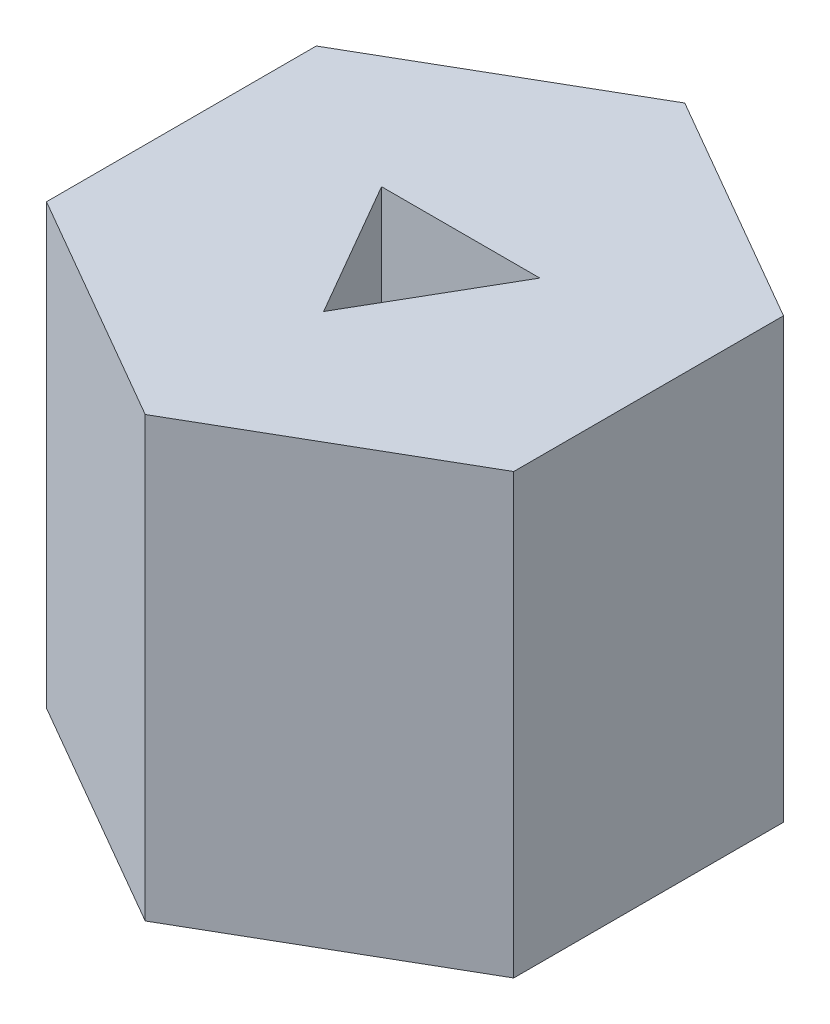
ISO-10303-21;
HEADER;
FILE_DESCRIPTION(('STEP AP214'),'2;1');
FILE_NAME('part.step','',(''),(''),'','','');
FILE_SCHEMA(('AUTOMOTIVE_DESIGN { 1 0 10303 214 1 1 1 1 }'));
ENDSEC;
DATA;
#1=APPLICATION_CONTEXT('core data for automotive mechanical design processes');
#2=APPLICATION_PROTOCOL_DEFINITION('international standard','automotive_design',2000,#1);
#3=PRODUCT_CONTEXT('',#1,'mechanical');
#4=PRODUCT('Part','Part','',(#3));
#5=PRODUCT_RELATED_PRODUCT_CATEGORY('part','',(#4));
#6=PRODUCT_DEFINITION_FORMATION('','',#4);
#7=PRODUCT_DEFINITION_CONTEXT('part definition',#1,'design');
#8=PRODUCT_DEFINITION('design','',#6,#7);
#9=PRODUCT_DEFINITION_SHAPE('','',#8);
#10=(LENGTH_UNIT() NAMED_UNIT(*) SI_UNIT(.MILLI.,.METRE.));
#11=(NAMED_UNIT(*) PLANE_ANGLE_UNIT() SI_UNIT($,.RADIAN.));
#12=(NAMED_UNIT(*) SI_UNIT($,.STERADIAN.) SOLID_ANGLE_UNIT());
#13=UNCERTAINTY_MEASURE_WITH_UNIT(LENGTH_MEASURE(1.E-05),#10,'distance_accuracy_value','');
#14=(GEOMETRIC_REPRESENTATION_CONTEXT(3) GLOBAL_UNCERTAINTY_ASSIGNED_CONTEXT((#13)) GLOBAL_UNIT_ASSIGNED_CONTEXT((#10,
#11,#12)) REPRESENTATION_CONTEXT('',''));
#15=CARTESIAN_POINT('',(0.,0.,0.));
#16=DIRECTION('',(0.,0.,1.));
#17=DIRECTION('',(1.,0.,0.));
#18=AXIS2_PLACEMENT_3D('',#15,#16,#17);
#19=CARTESIAN_POINT('',(6.39126747992918,12.,-3.69000000000011));
#20=DIRECTION('',(-0.499999999999995,0.,0.866025403784441));
#21=DIRECTION('',(0.866025403784442,0.,0.499999999999995));
#22=AXIS2_PLACEMENT_3D('',#19,#20,#21);
#23=PLANE('',#22);
#24=DIRECTION('',(-0.866025403784441,0.,-0.499999999999995));
#25=VECTOR('',#24,1.);
#26=CARTESIAN_POINT('',(6.39126747992918,0.,-3.69000000000011));
#27=LINE('',#26,#25);
#28=CARTESIAN_POINT('',(6.39126747992918,0.,-3.69000000000011));
#29=VERTEX_POINT('',#28);
#30=CARTESIAN_POINT('',(0.,0.,-7.38000000000007));
#31=VERTEX_POINT('',#30);
#32=EDGE_CURVE('E130',#29,#31,#27,.T.);
#33=ORIENTED_EDGE('',*,*,#32,.T.);
#34=DIRECTION('',(0.,-1.,0.));
#35=VECTOR('',#34,1.);
#36=CARTESIAN_POINT('',(0.,12.,-7.38000000000007));
#37=LINE('',#36,#35);
#38=CARTESIAN_POINT('',(0.,12.,-7.38000000000007));
#39=VERTEX_POINT('',#38);
#40=EDGE_CURVE('E11',#39,#31,#37,.T.);
#41=ORIENTED_EDGE('',*,*,#40,.F.);
#42=DIRECTION('',(-0.866025403784441,0.,-0.499999999999995));
#43=VECTOR('',#42,1.);
#44=CARTESIAN_POINT('',(6.39126747992918,12.,-3.69000000000011));
#45=LINE('',#44,#43);
#46=CARTESIAN_POINT('',(6.39126747992918,12.,-3.69000000000011));
#47=VERTEX_POINT('',#46);
#48=EDGE_CURVE('E131',#47,#39,#45,.T.);
#49=ORIENTED_EDGE('',*,*,#48,.F.);
#50=DIRECTION('',(0.,-1.,0.));
#51=VECTOR('',#50,1.);
#52=CARTESIAN_POINT('',(6.39126747992918,12.,-3.69000000000011));
#53=LINE('',#52,#51);
#54=EDGE_CURVE('E145',#47,#29,#53,.T.);
#55=ORIENTED_EDGE('',*,*,#54,.T.);
#56=EDGE_LOOP('',(#33,#41,#49,#55));
#57=FACE_BOUND('',#56,.T.);
#58=ADVANCED_FACE('F33',(#57),#23,.F.);
#59=CARTESIAN_POINT('',(0.,12.,-7.38000000000007));
#60=DIRECTION('',(0.500000000000001,0.,0.866025403784438));
#61=DIRECTION('',(0.866025403784438,0.,-0.500000000000001));
#62=AXIS2_PLACEMENT_3D('',#59,#60,#61);
#63=PLANE('',#62);
#64=DIRECTION('',(-0.866025403784438,0.,0.500000000000001));
#65=VECTOR('',#64,1.);
#66=CARTESIAN_POINT('',(0.,0.,-7.38000000000007));
#67=LINE('',#66,#65);
#68=CARTESIAN_POINT('',(-6.39126747992923,0.,-3.69000000000002));
#69=VERTEX_POINT('',#68);
#70=EDGE_CURVE('E148',#31,#69,#67,.T.);
#71=ORIENTED_EDGE('',*,*,#70,.T.);
#72=DIRECTION('',(0.,-1.,0.));
#73=VECTOR('',#72,1.);
#74=CARTESIAN_POINT('',(-6.39126747992923,12.,-3.69000000000002));
#75=LINE('',#74,#73);
#76=CARTESIAN_POINT('',(-6.39126747992923,12.,-3.69000000000002));
#77=VERTEX_POINT('',#76);
#78=EDGE_CURVE('E40',#77,#69,#75,.T.);
#79=ORIENTED_EDGE('',*,*,#78,.F.);
#80=DIRECTION('',(-0.866025403784438,0.,0.500000000000001));
#81=VECTOR('',#80,1.);
#82=CARTESIAN_POINT('',(0.,12.,-7.38000000000007));
#83=LINE('',#82,#81);
#84=EDGE_CURVE('E134',#39,#77,#83,.T.);
#85=ORIENTED_EDGE('',*,*,#84,.F.);
#86=ORIENTED_EDGE('',*,*,#40,.T.);
#87=EDGE_LOOP('',(#71,#79,#85,#86));
#88=FACE_BOUND('',#87,.T.);
#89=ADVANCED_FACE('F193',(#88),#63,.F.);
#90=CARTESIAN_POINT('',(-6.39126747992923,12.,-3.69000000000002));
#91=DIRECTION('',(1.,0.,0.));
#92=DIRECTION('',(0.,0.,-1.));
#93=AXIS2_PLACEMENT_3D('',#90,#91,#92);
#94=PLANE('',#93);
#95=DIRECTION('',(0.,0.,1.));
#96=VECTOR('',#95,1.);
#97=CARTESIAN_POINT('',(-6.39126747992923,0.,-3.69000000000002));
#98=LINE('',#97,#96);
#99=CARTESIAN_POINT('',(-6.3912674799292,0.,3.69000000000007));
#100=VERTEX_POINT('',#99);
#101=EDGE_CURVE('E150',#69,#100,#98,.T.);
#102=ORIENTED_EDGE('',*,*,#101,.T.);
#103=DIRECTION('',(0.,-1.,0.));
#104=VECTOR('',#103,1.);
#105=CARTESIAN_POINT('',(-6.3912674799292,12.,3.69000000000007));
#106=LINE('',#105,#104);
#107=CARTESIAN_POINT('',(-6.3912674799292,12.,3.69000000000007));
#108=VERTEX_POINT('',#107);
#109=EDGE_CURVE('E165',#108,#100,#106,.T.);
#110=ORIENTED_EDGE('',*,*,#109,.F.);
#111=DIRECTION('',(0.,0.,1.));
#112=VECTOR('',#111,1.);
#113=CARTESIAN_POINT('',(-6.39126747992923,12.,-3.69000000000002));
#114=LINE('',#113,#112);
#115=EDGE_CURVE('E137',#77,#108,#114,.T.);
#116=ORIENTED_EDGE('',*,*,#115,.F.);
#117=ORIENTED_EDGE('',*,*,#78,.T.);
#118=EDGE_LOOP('',(#102,#110,#116,#117));
#119=FACE_BOUND('',#118,.T.);
#120=ADVANCED_FACE('F172',(#119),#94,.F.);
#121=CARTESIAN_POINT('',(-6.3912674799292,12.,3.69000000000007));
#122=DIRECTION('',(0.499999999999995,0.,-0.866025403784441));
#123=DIRECTION('',(-0.866025403784442,0.,-0.499999999999995));
#124=AXIS2_PLACEMENT_3D('',#121,#122,#123);
#125=PLANE('',#124);
#126=DIRECTION('',(0.866025403784442,0.,0.499999999999995));
#127=VECTOR('',#126,1.);
#128=CARTESIAN_POINT('',(-6.3912674799292,0.,3.69000000000007));
#129=LINE('',#128,#127);
#130=CARTESIAN_POINT('',(0.,0.,7.38000000000007));
#131=VERTEX_POINT('',#130);
#132=EDGE_CURVE('E152',#100,#131,#129,.T.);
#133=ORIENTED_EDGE('',*,*,#132,.T.);
#134=DIRECTION('',(0.,-1.,0.));
#135=VECTOR('',#134,1.);
#136=CARTESIAN_POINT('',(0.,12.,7.38000000000007));
#137=LINE('',#136,#135);
#138=CARTESIAN_POINT('',(0.,12.,7.38000000000007));
#139=VERTEX_POINT('',#138);
#140=EDGE_CURVE('E162',#139,#131,#137,.T.);
#141=ORIENTED_EDGE('',*,*,#140,.F.);
#142=DIRECTION('',(0.866025403784442,0.,0.499999999999995));
#143=VECTOR('',#142,1.);
#144=CARTESIAN_POINT('',(-6.3912674799292,12.,3.69000000000007));
#145=LINE('',#144,#143);
#146=EDGE_CURVE('E139',#108,#139,#145,.T.);
#147=ORIENTED_EDGE('',*,*,#146,.F.);
#148=ORIENTED_EDGE('',*,*,#109,.T.);
#149=EDGE_LOOP('',(#133,#141,#147,#148));
#150=FACE_BOUND('',#149,.T.);
#151=ADVANCED_FACE('F181',(#150),#125,.F.);
#152=CARTESIAN_POINT('',(0.,12.,7.38000000000007));
#153=DIRECTION('',(-0.500000000000007,0.,-0.866025403784434));
#154=DIRECTION('',(-0.866025403784435,0.,0.500000000000007));
#155=AXIS2_PLACEMENT_3D('',#152,#153,#154);
#156=PLANE('',#155);
#157=DIRECTION('',(0.866025403784435,0.,-0.500000000000007));
#158=VECTOR('',#157,1.);
#159=CARTESIAN_POINT('',(0.,0.,7.38000000000007));
#160=LINE('',#159,#158);
#161=CARTESIAN_POINT('',(6.39126747992926,0.,3.68999999999998));
#162=VERTEX_POINT('',#161);
#163=EDGE_CURVE('E154',#131,#162,#160,.T.);
#164=ORIENTED_EDGE('',*,*,#163,.T.);
#165=DIRECTION('',(0.,-1.,0.));
#166=VECTOR('',#165,1.);
#167=CARTESIAN_POINT('',(6.39126747992926,12.,3.68999999999998));
#168=LINE('',#167,#166);
#169=CARTESIAN_POINT('',(6.39126747992926,12.,3.68999999999998));
#170=VERTEX_POINT('',#169);
#171=EDGE_CURVE('E159',#170,#162,#168,.T.);
#172=ORIENTED_EDGE('',*,*,#171,.F.);
#173=DIRECTION('',(0.866025403784435,0.,-0.500000000000007));
#174=VECTOR('',#173,1.);
#175=CARTESIAN_POINT('',(0.,12.,7.38000000000007));
#176=LINE('',#175,#174);
#177=EDGE_CURVE('E141',#139,#170,#176,.T.);
#178=ORIENTED_EDGE('',*,*,#177,.F.);
#179=ORIENTED_EDGE('',*,*,#140,.T.);
#180=EDGE_LOOP('',(#164,#172,#178,#179));
#181=FACE_BOUND('',#180,.T.);
#182=ADVANCED_FACE('F185',(#181),#156,.F.);
#183=CARTESIAN_POINT('',(6.39126747992926,12.,3.68999999999998));
#184=DIRECTION('',(-1.,0.,0.));
#185=DIRECTION('',(0.,0.,1.));
#186=AXIS2_PLACEMENT_3D('',#183,#184,#185);
#187=PLANE('',#186);
#188=DIRECTION('',(0.,0.,-1.));
#189=VECTOR('',#188,1.);
#190=CARTESIAN_POINT('',(6.39126747992926,0.,3.68999999999998));
#191=LINE('',#190,#189);
#192=EDGE_CURVE('E135',#162,#29,#191,.T.);
#193=ORIENTED_EDGE('',*,*,#192,.T.);
#194=ORIENTED_EDGE('',*,*,#54,.F.);
#195=DIRECTION('',(0.,0.,-1.));
#196=VECTOR('',#195,1.);
#197=CARTESIAN_POINT('',(6.39126747992926,12.,3.68999999999998));
#198=LINE('',#197,#196);
#199=EDGE_CURVE('E143',#170,#47,#198,.T.);
#200=ORIENTED_EDGE('',*,*,#199,.F.);
#201=ORIENTED_EDGE('',*,*,#171,.T.);
#202=EDGE_LOOP('',(#193,#194,#200,#201));
#203=FACE_BOUND('',#202,.T.);
#204=ADVANCED_FACE('F196',(#203),#187,.F.);
#205=CARTESIAN_POINT('',(0.,12.,0.));
#206=DIRECTION('',(0.,1.,0.));
#207=DIRECTION('',(0.,0.,1.));
#208=AXIS2_PLACEMENT_3D('',#205,#206,#207);
#209=PLANE('',#208);
#210=DIRECTION('',(-1.,0.,0.));
#211=VECTOR('',#210,1.);
#212=CARTESIAN_POINT('',(0.,12.,-1.24999999999998));
#213=LINE('',#212,#211);
#214=CARTESIAN_POINT('',(2.16506350946111,12.,-1.24999999999998));
#215=VERTEX_POINT('',#214);
#216=CARTESIAN_POINT('',(-2.16506350946111,12.,-1.24999999999998));
#217=VERTEX_POINT('',#216);
#218=EDGE_CURVE('E128',#215,#217,#213,.T.);
#219=ORIENTED_EDGE('',*,*,#218,.F.);
#220=DIRECTION('',(0.500000000000004,0.,-0.866025403784436));
#221=VECTOR('',#220,1.);
#222=CARTESIAN_POINT('',(1.08253175473055,12.,0.62500000000001));
#223=LINE('',#222,#221);
#224=CARTESIAN_POINT('',(0.,12.,2.5));
#225=VERTEX_POINT('',#224);
#226=EDGE_CURVE('E124',#225,#215,#223,.T.);
#227=ORIENTED_EDGE('',*,*,#226,.F.);
#228=DIRECTION('',(0.500000000000004,0.,0.866025403784436));
#229=VECTOR('',#228,1.);
#230=CARTESIAN_POINT('',(-1.08253175473055,12.,0.62500000000001));
#231=LINE('',#230,#229);
#232=EDGE_CURVE('E108',#217,#225,#231,.T.);
#233=ORIENTED_EDGE('',*,*,#232,.F.);
#234=EDGE_LOOP('',(#219,#227,#233));
#235=FACE_BOUND('',#234,.T.);
#236=ORIENTED_EDGE('',*,*,#48,.T.);
#237=ORIENTED_EDGE('',*,*,#84,.T.);
#238=ORIENTED_EDGE('',*,*,#115,.T.);
#239=ORIENTED_EDGE('',*,*,#146,.T.);
#240=ORIENTED_EDGE('',*,*,#177,.T.);
#241=ORIENTED_EDGE('',*,*,#199,.T.);
#242=EDGE_LOOP('',(#236,#237,#238,#239,#240,#241));
#243=FACE_BOUND('',#242,.T.);
#244=ADVANCED_FACE('F189',(#235,#243),#209,.T.);
#245=CARTESIAN_POINT('',(0.,0.,0.));
#246=DIRECTION('',(0.,1.,0.));
#247=DIRECTION('',(0.,0.,1.));
#248=AXIS2_PLACEMENT_3D('',#245,#246,#247);
#249=PLANE('',#248);
#250=DIRECTION('',(-0.500000000000004,0.,0.866025403784436));
#251=VECTOR('',#250,1.);
#252=CARTESIAN_POINT('',(1.08253175473055,0.,0.62500000000001));
#253=LINE('',#252,#251);
#254=CARTESIAN_POINT('',(2.16506350946111,0.,-1.24999999999998));
#255=VERTEX_POINT('',#254);
#256=CARTESIAN_POINT('',(0.,0.,2.5));
#257=VERTEX_POINT('',#256);
#258=EDGE_CURVE('E114',#255,#257,#253,.T.);
#259=ORIENTED_EDGE('',*,*,#258,.F.);
#260=DIRECTION('',(1.,0.,0.));
#261=VECTOR('',#260,1.);
#262=CARTESIAN_POINT('',(0.,0.,-1.24999999999998));
#263=LINE('',#262,#261);
#264=CARTESIAN_POINT('',(-2.16506350946111,0.,-1.24999999999998));
#265=VERTEX_POINT('',#264);
#266=EDGE_CURVE('E55',#265,#255,#263,.T.);
#267=ORIENTED_EDGE('',*,*,#266,.F.);
#268=DIRECTION('',(-0.500000000000004,0.,-0.866025403784436));
#269=VECTOR('',#268,1.);
#270=CARTESIAN_POINT('',(-1.08253175473055,0.,0.62500000000001));
#271=LINE('',#270,#269);
#272=EDGE_CURVE('E106',#257,#265,#271,.T.);
#273=ORIENTED_EDGE('',*,*,#272,.F.);
#274=EDGE_LOOP('',(#259,#267,#273));
#275=FACE_BOUND('',#274,.T.);
#276=ORIENTED_EDGE('',*,*,#32,.F.);
#277=ORIENTED_EDGE('',*,*,#192,.F.);
#278=ORIENTED_EDGE('',*,*,#163,.F.);
#279=ORIENTED_EDGE('',*,*,#132,.F.);
#280=ORIENTED_EDGE('',*,*,#101,.F.);
#281=ORIENTED_EDGE('',*,*,#70,.F.);
#282=EDGE_LOOP('',(#276,#277,#278,#279,#280,#281));
#283=FACE_BOUND('',#282,.T.);
#284=ADVANCED_FACE('F118',(#275,#283),#249,.F.);
#285=CARTESIAN_POINT('',(0.,20.,-1.24999999999998));
#286=DIRECTION('',(0.,0.,-1.));
#287=DIRECTION('',(-1.,0.,0.));
#288=AXIS2_PLACEMENT_3D('',#285,#286,#287);
#289=PLANE('',#288);
#290=ORIENTED_EDGE('',*,*,#218,.T.);
#291=DIRECTION('',(0.,-1.,0.));
#292=VECTOR('',#291,1.);
#293=CARTESIAN_POINT('',(-2.16506350946111,20.,-1.24999999999998));
#294=LINE('',#293,#292);
#295=EDGE_CURVE('E110',#217,#265,#294,.T.);
#296=ORIENTED_EDGE('',*,*,#295,.T.);
#297=ORIENTED_EDGE('',*,*,#266,.T.);
#298=DIRECTION('',(0.,-1.,0.));
#299=VECTOR('',#298,1.);
#300=CARTESIAN_POINT('',(2.16506350946111,20.,-1.24999999999998));
#301=LINE('',#300,#299);
#302=EDGE_CURVE('E111',#215,#255,#301,.T.);
#303=ORIENTED_EDGE('',*,*,#302,.F.);
#304=EDGE_LOOP('',(#290,#296,#297,#303));
#305=FACE_BOUND('',#304,.T.);
#306=ADVANCED_FACE('F244',(#305),#289,.F.);
#307=CARTESIAN_POINT('',(-1.08253175473055,20.,0.62500000000001));
#308=DIRECTION('',(-0.866025403784436,0.,0.500000000000004));
#309=DIRECTION('',(0.500000000000004,0.,0.866025403784436));
#310=AXIS2_PLACEMENT_3D('',#307,#308,#309);
#311=PLANE('',#310);
#312=ORIENTED_EDGE('',*,*,#232,.T.);
#313=DIRECTION('',(0.,-1.,0.));
#314=VECTOR('',#313,1.);
#315=CARTESIAN_POINT('',(0.,20.,2.5));
#316=LINE('',#315,#314);
#317=EDGE_CURVE('E47',#225,#257,#316,.T.);
#318=ORIENTED_EDGE('',*,*,#317,.T.);
#319=ORIENTED_EDGE('',*,*,#272,.T.);
#320=ORIENTED_EDGE('',*,*,#295,.F.);
#321=EDGE_LOOP('',(#312,#318,#319,#320));
#322=FACE_BOUND('',#321,.T.);
#323=ADVANCED_FACE('F103',(#322),#311,.F.);
#324=CARTESIAN_POINT('',(1.08253175473055,20.,0.62500000000001));
#325=DIRECTION('',(0.866025403784436,0.,0.500000000000004));
#326=DIRECTION('',(0.500000000000004,0.,-0.866025403784436));
#327=AXIS2_PLACEMENT_3D('',#324,#325,#326);
#328=PLANE('',#327);
#329=ORIENTED_EDGE('',*,*,#226,.T.);
#330=ORIENTED_EDGE('',*,*,#302,.T.);
#331=ORIENTED_EDGE('',*,*,#258,.T.);
#332=ORIENTED_EDGE('',*,*,#317,.F.);
#333=EDGE_LOOP('',(#329,#330,#331,#332));
#334=FACE_BOUND('',#333,.T.);
#335=ADVANCED_FACE('F115',(#334),#328,.F.);
#336=CLOSED_SHELL('',(#58,#89,#120,#151,#182,#204,#244,#284,#306,#323,#335));
#337=MANIFOLD_SOLID_BREP('B2',#336);
#338=ADVANCED_BREP_SHAPE_REPRESENTATION('',(#18,#337),#14);
#339=SHAPE_DEFINITION_REPRESENTATION(#9,#338);
ENDSEC;
END-ISO-10303-21;
